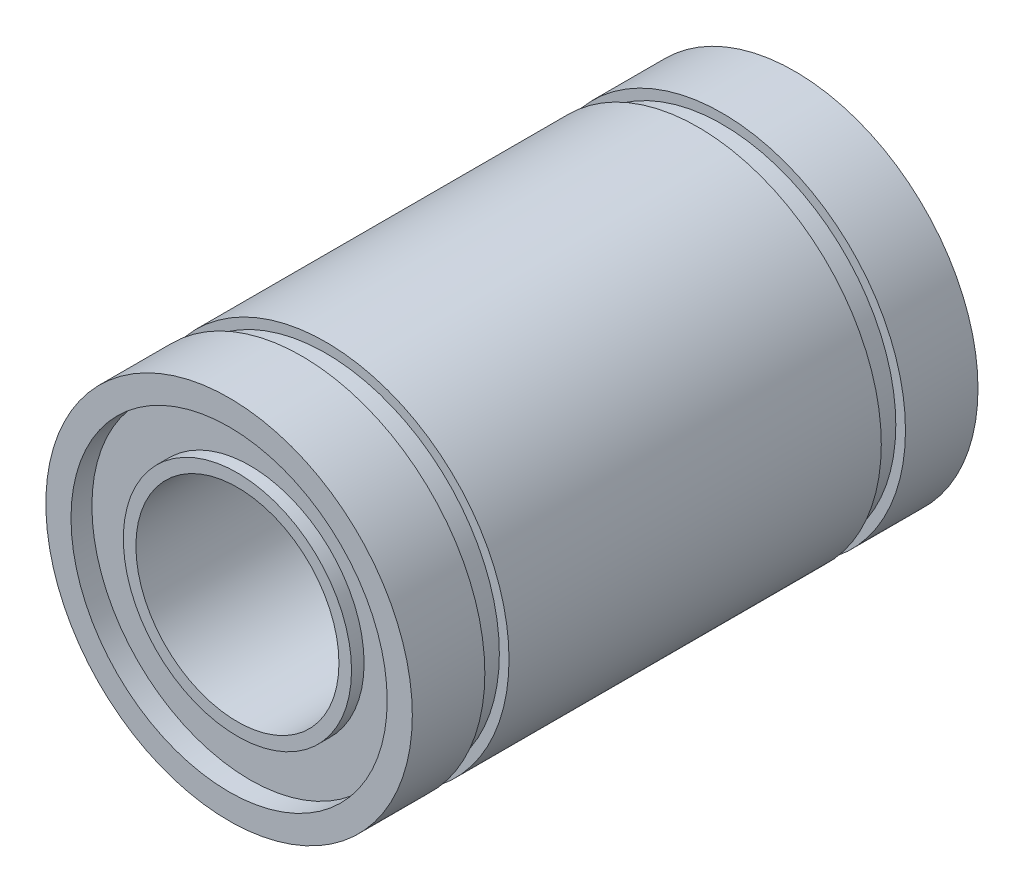
ISO-10303-21;
HEADER;
FILE_DESCRIPTION(('STEP AP214'),'2;1');
FILE_NAME('part.step','',(''),(''),'','','');
FILE_SCHEMA(('AUTOMOTIVE_DESIGN { 1 0 10303 214 1 1 1 1 }'));
ENDSEC;
DATA;
#1=APPLICATION_CONTEXT('core data for automotive mechanical design processes');
#2=APPLICATION_PROTOCOL_DEFINITION('international standard','automotive_design',2000,#1);
#3=PRODUCT_CONTEXT('',#1,'mechanical');
#4=PRODUCT('Part','Part','',(#3));
#5=PRODUCT_RELATED_PRODUCT_CATEGORY('part','',(#4));
#6=PRODUCT_DEFINITION_FORMATION('','',#4);
#7=PRODUCT_DEFINITION_CONTEXT('part definition',#1,'design');
#8=PRODUCT_DEFINITION('design','',#6,#7);
#9=PRODUCT_DEFINITION_SHAPE('','',#8);
#10=(LENGTH_UNIT() NAMED_UNIT(*) SI_UNIT(.MILLI.,.METRE.));
#11=(NAMED_UNIT(*) PLANE_ANGLE_UNIT() SI_UNIT($,.RADIAN.));
#12=(NAMED_UNIT(*) SI_UNIT($,.STERADIAN.) SOLID_ANGLE_UNIT());
#13=UNCERTAINTY_MEASURE_WITH_UNIT(LENGTH_MEASURE(1.E-05),#10,'distance_accuracy_value','');
#14=(GEOMETRIC_REPRESENTATION_CONTEXT(3) GLOBAL_UNCERTAINTY_ASSIGNED_CONTEXT((#13)) GLOBAL_UNIT_ASSIGNED_CONTEXT((#10,
#11,#12)) REPRESENTATION_CONTEXT('',''));
#15=CARTESIAN_POINT('',(0.,0.,0.));
#16=DIRECTION('',(0.,0.,1.));
#17=DIRECTION('',(1.,0.,0.));
#18=AXIS2_PLACEMENT_3D('',#15,#16,#17);
#19=CARTESIAN_POINT('',(8.175,0.,28.169061095084));
#20=DIRECTION('',(0.,0.,-1.));
#21=DIRECTION('',(1.,0.,0.));
#22=AXIS2_PLACEMENT_3D('',#19,#20,#21);
#23=PLANE('',#22);
#24=CARTESIAN_POINT('',(0.,0.,28.169061095084));
#25=DIRECTION('',(0.,0.,1.));
#26=DIRECTION('',(1.,0.,0.));
#27=AXIS2_PLACEMENT_3D('',#24,#25,#26);
#28=CIRCLE('',#27,8.175);
#29=CARTESIAN_POINT('',(8.175,0.,28.169061095084));
#30=VERTEX_POINT('',#29);
#31=EDGE_CURVE('E54',#30,#30,#28,.T.);
#32=ORIENTED_EDGE('',*,*,#31,.T.);
#33=EDGE_LOOP('',(#32));
#34=FACE_BOUND('',#33,.T.);
#35=CARTESIAN_POINT('',(0.,0.,28.169061095084));
#36=DIRECTION('',(0.,0.,-1.));
#37=DIRECTION('',(-1.,0.,0.));
#38=AXIS2_PLACEMENT_3D('',#35,#36,#37);
#39=CIRCLE('',#38,5.89999999999996);
#40=CARTESIAN_POINT('',(-5.89999999999996,0.,28.169061095084));
#41=VERTEX_POINT('',#40);
#42=EDGE_CURVE('E10',#41,#41,#39,.F.);
#43=ORIENTED_EDGE('',*,*,#42,.F.);
#44=EDGE_LOOP('',(#43));
#45=FACE_BOUND('',#44,.T.);
#46=ADVANCED_FACE('F32',(#34,#45),#23,.F.);
#47=CARTESIAN_POINT('',(8.175,0.,1.1));
#48=DIRECTION('',(0.,0.,1.));
#49=DIRECTION('',(1.,0.,0.));
#50=AXIS2_PLACEMENT_3D('',#47,#48,#49);
#51=PLANE('',#50);
#52=CARTESIAN_POINT('',(0.,0.,1.1));
#53=DIRECTION('',(0.,0.,1.));
#54=DIRECTION('',(1.,0.,0.));
#55=AXIS2_PLACEMENT_3D('',#52,#53,#54);
#56=CIRCLE('',#55,8.175);
#57=CARTESIAN_POINT('',(8.175,0.,1.1));
#58=VERTEX_POINT('',#57);
#59=EDGE_CURVE('E71',#58,#58,#56,.T.);
#60=ORIENTED_EDGE('',*,*,#59,.F.);
#61=EDGE_LOOP('',(#60));
#62=FACE_BOUND('',#61,.T.);
#63=CARTESIAN_POINT('',(0.,0.,1.1));
#64=DIRECTION('',(0.,0.,1.));
#65=DIRECTION('',(1.,0.,0.));
#66=AXIS2_PLACEMENT_3D('',#63,#64,#65);
#67=CIRCLE('',#66,5.89999999999996);
#68=CARTESIAN_POINT('',(5.89999999999996,0.,1.1));
#69=VERTEX_POINT('',#68);
#70=EDGE_CURVE('E39',#69,#69,#67,.F.);
#71=ORIENTED_EDGE('',*,*,#70,.F.);
#72=EDGE_LOOP('',(#71));
#73=FACE_BOUND('',#72,.T.);
#74=ADVANCED_FACE('F114',(#62,#73),#51,.F.);
#75=CARTESIAN_POINT('',(0.,0.,29.25));
#76=DIRECTION('',(0.,0.,-1.));
#77=DIRECTION('',(-1.,0.,0.));
#78=AXIS2_PLACEMENT_3D('',#75,#76,#77);
#79=CYLINDRICAL_SURFACE('',#78,9.475);
#80=CARTESIAN_POINT('',(0.,0.,3.75));
#81=DIRECTION('',(0.,0.,1.));
#82=DIRECTION('',(1.,0.,0.));
#83=AXIS2_PLACEMENT_3D('',#80,#81,#82);
#84=CIRCLE('',#83,9.475);
#85=CARTESIAN_POINT('',(9.475,0.,3.75));
#86=VERTEX_POINT('',#85);
#87=EDGE_CURVE('E61',#86,#86,#84,.T.);
#88=ORIENTED_EDGE('',*,*,#87,.F.);
#89=EDGE_LOOP('',(#88));
#90=FACE_BOUND('',#89,.T.);
#91=CARTESIAN_POINT('',(0.,0.,0.));
#92=DIRECTION('',(0.,0.,1.));
#93=DIRECTION('',(1.,0.,0.));
#94=AXIS2_PLACEMENT_3D('',#91,#92,#93);
#95=CIRCLE('',#94,9.475);
#96=CARTESIAN_POINT('',(9.475,0.,0.));
#97=VERTEX_POINT('',#96);
#98=EDGE_CURVE('E47',#97,#97,#95,.T.);
#99=ORIENTED_EDGE('',*,*,#98,.T.);
#100=EDGE_LOOP('',(#99));
#101=FACE_BOUND('',#100,.T.);
#102=ADVANCED_FACE('F34',(#90,#101),#79,.T.);
#103=CARTESIAN_POINT('',(0.,0.,0.));
#104=DIRECTION('',(0.,0.,1.));
#105=DIRECTION('',(1.,0.,0.));
#106=AXIS2_PLACEMENT_3D('',#103,#104,#105);
#107=PLANE('',#106);
#108=CARTESIAN_POINT('',(0.,0.,0.));
#109=DIRECTION('',(0.,0.,1.));
#110=DIRECTION('',(1.,0.,0.));
#111=AXIS2_PLACEMENT_3D('',#108,#109,#110);
#112=CIRCLE('',#111,8.175);
#113=CARTESIAN_POINT('',(8.175,0.,0.));
#114=VERTEX_POINT('',#113);
#115=EDGE_CURVE('E53',#114,#114,#112,.T.);
#116=ORIENTED_EDGE('',*,*,#115,.T.);
#117=EDGE_LOOP('',(#116));
#118=FACE_BOUND('',#117,.T.);
#119=ORIENTED_EDGE('',*,*,#98,.F.);
#120=EDGE_LOOP('',(#119));
#121=FACE_BOUND('',#120,.T.);
#122=ADVANCED_FACE('F144',(#118,#121),#107,.F.);
#123=CARTESIAN_POINT('',(9.475,0.,5.));
#124=DIRECTION('',(0.,0.,1.));
#125=DIRECTION('',(1.,0.,0.));
#126=AXIS2_PLACEMENT_3D('',#123,#124,#125);
#127=PLANE('',#126);
#128=CARTESIAN_POINT('',(0.,0.,5.));
#129=DIRECTION('',(0.,0.,1.));
#130=DIRECTION('',(1.,0.,0.));
#131=AXIS2_PLACEMENT_3D('',#128,#129,#130);
#132=CIRCLE('',#131,9.475);
#133=CARTESIAN_POINT('',(9.475,0.,5.));
#134=VERTEX_POINT('',#133);
#135=EDGE_CURVE('E56',#134,#134,#132,.T.);
#136=ORIENTED_EDGE('',*,*,#135,.F.);
#137=EDGE_LOOP('',(#136));
#138=FACE_BOUND('',#137,.T.);
#139=CARTESIAN_POINT('',(0.,0.,5.));
#140=DIRECTION('',(0.,0.,1.));
#141=DIRECTION('',(1.,0.,0.));
#142=AXIS2_PLACEMENT_3D('',#139,#140,#141);
#143=CIRCLE('',#142,8.975);
#144=CARTESIAN_POINT('',(8.975,0.,5.));
#145=VERTEX_POINT('',#144);
#146=EDGE_CURVE('E74',#145,#145,#143,.T.);
#147=ORIENTED_EDGE('',*,*,#146,.T.);
#148=EDGE_LOOP('',(#147));
#149=FACE_BOUND('',#148,.T.);
#150=ADVANCED_FACE('F140',(#138,#149),#127,.F.);
#151=CARTESIAN_POINT('',(0.,0.,29.25));
#152=DIRECTION('',(0.,0.,1.));
#153=DIRECTION('',(1.,0.,0.));
#154=AXIS2_PLACEMENT_3D('',#151,#152,#153);
#155=CYLINDRICAL_SURFACE('',#154,8.975);
#156=ORIENTED_EDGE('',*,*,#146,.F.);
#157=EDGE_LOOP('',(#156));
#158=FACE_BOUND('',#157,.T.);
#159=CARTESIAN_POINT('',(0.,0.,3.75));
#160=DIRECTION('',(0.,0.,1.));
#161=DIRECTION('',(1.,0.,0.));
#162=AXIS2_PLACEMENT_3D('',#159,#160,#161);
#163=CIRCLE('',#162,8.975);
#164=CARTESIAN_POINT('',(8.975,0.,3.75));
#165=VERTEX_POINT('',#164);
#166=EDGE_CURVE('E77',#165,#165,#163,.T.);
#167=ORIENTED_EDGE('',*,*,#166,.T.);
#168=EDGE_LOOP('',(#167));
#169=FACE_BOUND('',#168,.T.);
#170=ADVANCED_FACE('F136',(#158,#169),#155,.T.);
#171=CARTESIAN_POINT('',(9.475,0.,3.75));
#172=DIRECTION('',(0.,0.,-1.));
#173=DIRECTION('',(-1.,0.,0.));
#174=AXIS2_PLACEMENT_3D('',#171,#172,#173);
#175=PLANE('',#174);
#176=ORIENTED_EDGE('',*,*,#166,.F.);
#177=EDGE_LOOP('',(#176));
#178=FACE_BOUND('',#177,.T.);
#179=ORIENTED_EDGE('',*,*,#87,.T.);
#180=EDGE_LOOP('',(#179));
#181=FACE_BOUND('',#180,.T.);
#182=ADVANCED_FACE('F132',(#178,#181),#175,.F.);
#183=ORIENTED_EDGE('',*,*,#135,.T.);
#184=EDGE_LOOP('',(#183));
#185=FACE_BOUND('',#184,.T.);
#186=CARTESIAN_POINT('',(0.,0.,24.25));
#187=DIRECTION('',(0.,0.,1.));
#188=DIRECTION('',(1.,0.,0.));
#189=AXIS2_PLACEMENT_3D('',#186,#187,#188);
#190=CIRCLE('',#189,9.475);
#191=CARTESIAN_POINT('',(9.475,0.,24.25));
#192=VERTEX_POINT('',#191);
#193=EDGE_CURVE('E68',#192,#192,#190,.T.);
#194=ORIENTED_EDGE('',*,*,#193,.F.);
#195=EDGE_LOOP('',(#194));
#196=FACE_BOUND('',#195,.T.);
#197=ADVANCED_FACE('F135',(#185,#196),#79,.T.);
#198=CARTESIAN_POINT('',(9.475,0.,25.5));
#199=DIRECTION('',(0.,0.,1.));
#200=DIRECTION('',(1.,0.,0.));
#201=AXIS2_PLACEMENT_3D('',#198,#199,#200);
#202=PLANE('',#201);
#203=CARTESIAN_POINT('',(0.,0.,25.5));
#204=DIRECTION('',(0.,0.,1.));
#205=DIRECTION('',(1.,0.,0.));
#206=AXIS2_PLACEMENT_3D('',#203,#204,#205);
#207=CIRCLE('',#206,9.475);
#208=CARTESIAN_POINT('',(9.475,0.,25.5));
#209=VERTEX_POINT('',#208);
#210=EDGE_CURVE('E58',#209,#209,#207,.T.);
#211=ORIENTED_EDGE('',*,*,#210,.F.);
#212=EDGE_LOOP('',(#211));
#213=FACE_BOUND('',#212,.T.);
#214=CARTESIAN_POINT('',(0.,0.,25.5));
#215=DIRECTION('',(0.,0.,1.));
#216=DIRECTION('',(1.,0.,0.));
#217=AXIS2_PLACEMENT_3D('',#214,#215,#216);
#218=CIRCLE('',#217,8.975);
#219=CARTESIAN_POINT('',(8.975,0.,25.5));
#220=VERTEX_POINT('',#219);
#221=EDGE_CURVE('E62',#220,#220,#218,.T.);
#222=ORIENTED_EDGE('',*,*,#221,.T.);
#223=EDGE_LOOP('',(#222));
#224=FACE_BOUND('',#223,.T.);
#225=ADVANCED_FACE('F154',(#213,#224),#202,.F.);
#226=CARTESIAN_POINT('',(0.,0.,29.25));
#227=DIRECTION('',(0.,0.,1.));
#228=DIRECTION('',(1.,0.,0.));
#229=AXIS2_PLACEMENT_3D('',#226,#227,#228);
#230=CYLINDRICAL_SURFACE('',#229,8.975);
#231=ORIENTED_EDGE('',*,*,#221,.F.);
#232=EDGE_LOOP('',(#231));
#233=FACE_BOUND('',#232,.T.);
#234=CARTESIAN_POINT('',(0.,0.,24.25));
#235=DIRECTION('',(0.,0.,1.));
#236=DIRECTION('',(1.,0.,0.));
#237=AXIS2_PLACEMENT_3D('',#234,#235,#236);
#238=CIRCLE('',#237,8.975);
#239=CARTESIAN_POINT('',(8.975,0.,24.25));
#240=VERTEX_POINT('',#239);
#241=EDGE_CURVE('E65',#240,#240,#238,.T.);
#242=ORIENTED_EDGE('',*,*,#241,.T.);
#243=EDGE_LOOP('',(#242));
#244=FACE_BOUND('',#243,.T.);
#245=ADVANCED_FACE('F150',(#233,#244),#230,.T.);
#246=CARTESIAN_POINT('',(9.475,0.,24.25));
#247=DIRECTION('',(0.,0.,-1.));
#248=DIRECTION('',(-1.,0.,0.));
#249=AXIS2_PLACEMENT_3D('',#246,#247,#248);
#250=PLANE('',#249);
#251=ORIENTED_EDGE('',*,*,#241,.F.);
#252=EDGE_LOOP('',(#251));
#253=FACE_BOUND('',#252,.T.);
#254=ORIENTED_EDGE('',*,*,#193,.T.);
#255=EDGE_LOOP('',(#254));
#256=FACE_BOUND('',#255,.T.);
#257=ADVANCED_FACE('F146',(#253,#256),#250,.F.);
#258=CARTESIAN_POINT('',(0.,0.,29.25));
#259=DIRECTION('',(0.,0.,1.));
#260=DIRECTION('',(1.,0.,0.));
#261=AXIS2_PLACEMENT_3D('',#258,#259,#260);
#262=PLANE('',#261);
#263=CARTESIAN_POINT('',(0.,0.,29.25));
#264=DIRECTION('',(0.,0.,1.));
#265=DIRECTION('',(1.,0.,0.));
#266=AXIS2_PLACEMENT_3D('',#263,#264,#265);
#267=CIRCLE('',#266,8.175);
#268=CARTESIAN_POINT('',(8.175,0.,29.25));
#269=VERTEX_POINT('',#268);
#270=EDGE_CURVE('E50',#269,#269,#267,.T.);
#271=ORIENTED_EDGE('',*,*,#270,.F.);
#272=EDGE_LOOP('',(#271));
#273=FACE_BOUND('',#272,.T.);
#274=CARTESIAN_POINT('',(0.,0.,29.25));
#275=DIRECTION('',(0.,0.,1.));
#276=DIRECTION('',(1.,0.,0.));
#277=AXIS2_PLACEMENT_3D('',#274,#275,#276);
#278=CIRCLE('',#277,9.475);
#279=CARTESIAN_POINT('',(9.475,0.,29.25));
#280=VERTEX_POINT('',#279);
#281=EDGE_CURVE('E43',#280,#280,#278,.T.);
#282=ORIENTED_EDGE('',*,*,#281,.T.);
#283=EDGE_LOOP('',(#282));
#284=FACE_BOUND('',#283,.T.);
#285=ADVANCED_FACE('F149',(#273,#284),#262,.T.);
#286=ORIENTED_EDGE('',*,*,#210,.T.);
#287=EDGE_LOOP('',(#286));
#288=FACE_BOUND('',#287,.T.);
#289=ORIENTED_EDGE('',*,*,#281,.F.);
#290=EDGE_LOOP('',(#289));
#291=FACE_BOUND('',#290,.T.);
#292=ADVANCED_FACE('F129',(#288,#291),#79,.T.);
#293=CARTESIAN_POINT('',(0.,0.,29.25));
#294=DIRECTION('',(0.,0.,1.));
#295=DIRECTION('',(1.,0.,0.));
#296=AXIS2_PLACEMENT_3D('',#293,#294,#295);
#297=CYLINDRICAL_SURFACE('',#296,8.175);
#298=ORIENTED_EDGE('',*,*,#115,.F.);
#299=EDGE_LOOP('',(#298));
#300=FACE_BOUND('',#299,.T.);
#301=ORIENTED_EDGE('',*,*,#59,.T.);
#302=EDGE_LOOP('',(#301));
#303=FACE_BOUND('',#302,.T.);
#304=ADVANCED_FACE('F127',(#300,#303),#297,.F.);
#305=CARTESIAN_POINT('',(0.,0.,0.0190610950839831));
#306=DIRECTION('',(0.,0.,-1.));
#307=DIRECTION('',(1.,0.,0.));
#308=AXIS2_PLACEMENT_3D('',#305,#306,#307);
#309=CYLINDRICAL_SURFACE('',#308,8.175);
#310=ORIENTED_EDGE('',*,*,#270,.T.);
#311=EDGE_LOOP('',(#310));
#312=FACE_BOUND('',#311,.T.);
#313=ORIENTED_EDGE('',*,*,#31,.F.);
#314=EDGE_LOOP('',(#313));
#315=FACE_BOUND('',#314,.T.);
#316=ADVANCED_FACE('F125',(#312,#315),#309,.F.);
#317=CARTESIAN_POINT('',(0.,0.,1.1));
#318=DIRECTION('',(0.,0.,-1.));
#319=DIRECTION('',(-1.,0.,0.));
#320=AXIS2_PLACEMENT_3D('',#317,#318,#319);
#321=CYLINDRICAL_SURFACE('',#320,5.24999999999999);
#322=CARTESIAN_POINT('',(0.,0.,0.449999999999999));
#323=DIRECTION('',(0.,0.,1.));
#324=DIRECTION('',(1.,0.,0.));
#325=AXIS2_PLACEMENT_3D('',#322,#323,#324);
#326=CIRCLE('',#325,5.24999999999996);
#327=CARTESIAN_POINT('',(5.24999999999996,0.,0.449999999999999));
#328=VERTEX_POINT('',#327);
#329=EDGE_CURVE('E91',#328,#328,#326,.T.);
#330=ORIENTED_EDGE('',*,*,#329,.F.);
#331=EDGE_LOOP('',(#330));
#332=FACE_BOUND('',#331,.T.);
#333=CARTESIAN_POINT('',(0.,0.,28.819061095084));
#334=DIRECTION('',(0.,0.,1.));
#335=DIRECTION('',(1.,0.,0.));
#336=AXIS2_PLACEMENT_3D('',#333,#334,#335);
#337=CIRCLE('',#336,5.24999999999996);
#338=CARTESIAN_POINT('',(5.24999999999996,0.,28.819061095084));
#339=VERTEX_POINT('',#338);
#340=EDGE_CURVE('E97',#339,#339,#337,.T.);
#341=ORIENTED_EDGE('',*,*,#340,.T.);
#342=EDGE_LOOP('',(#341));
#343=FACE_BOUND('',#342,.T.);
#344=ADVANCED_FACE('F101',(#332,#343),#321,.F.);
#345=CARTESIAN_POINT('',(0.,0.,29.269061095084));
#346=DIRECTION('',(0.,0.,1.));
#347=DIRECTION('',(1.,0.,0.));
#348=AXIS2_PLACEMENT_3D('',#345,#346,#347);
#349=CYLINDRICAL_SURFACE('',#348,5.89999999999996);
#350=ORIENTED_EDGE('',*,*,#70,.T.);
#351=EDGE_LOOP('',(#350));
#352=FACE_BOUND('',#351,.T.);
#353=CARTESIAN_POINT('',(0.,0.,0.449999999999999));
#354=DIRECTION('',(0.,0.,1.));
#355=DIRECTION('',(1.,0.,0.));
#356=AXIS2_PLACEMENT_3D('',#353,#354,#355);
#357=CIRCLE('',#356,5.89999999999996);
#358=CARTESIAN_POINT('',(5.89999999999996,0.,0.449999999999999));
#359=VERTEX_POINT('',#358);
#360=EDGE_CURVE('E88',#359,#359,#357,.T.);
#361=ORIENTED_EDGE('',*,*,#360,.T.);
#362=EDGE_LOOP('',(#361));
#363=FACE_BOUND('',#362,.T.);
#364=ADVANCED_FACE('F213',(#352,#363),#349,.T.);
#365=CARTESIAN_POINT('',(0.,5.24999999999996,0.449999999999999));
#366=DIRECTION('',(0.,0.,1.));
#367=DIRECTION('',(1.,0.,0.));
#368=AXIS2_PLACEMENT_3D('',#365,#366,#367);
#369=PLANE('',#368);
#370=ORIENTED_EDGE('',*,*,#360,.F.);
#371=EDGE_LOOP('',(#370));
#372=FACE_BOUND('',#371,.T.);
#373=ORIENTED_EDGE('',*,*,#329,.T.);
#374=EDGE_LOOP('',(#373));
#375=FACE_BOUND('',#374,.T.);
#376=ADVANCED_FACE('F111',(#372,#375),#369,.F.);
#377=CARTESIAN_POINT('',(0.,0.,0.));
#378=DIRECTION('',(0.,0.,-1.));
#379=DIRECTION('',(1.,0.,0.));
#380=AXIS2_PLACEMENT_3D('',#377,#378,#379);
#381=CYLINDRICAL_SURFACE('',#380,5.89999999999996);
#382=ORIENTED_EDGE('',*,*,#42,.T.);
#383=EDGE_LOOP('',(#382));
#384=FACE_BOUND('',#383,.T.);
#385=CARTESIAN_POINT('',(0.,0.,28.819061095084));
#386=DIRECTION('',(0.,0.,1.));
#387=DIRECTION('',(1.,0.,0.));
#388=AXIS2_PLACEMENT_3D('',#385,#386,#387);
#389=CIRCLE('',#388,5.89999999999996);
#390=CARTESIAN_POINT('',(5.89999999999996,0.,28.819061095084));
#391=VERTEX_POINT('',#390);
#392=EDGE_CURVE('E94',#391,#391,#389,.T.);
#393=ORIENTED_EDGE('',*,*,#392,.F.);
#394=EDGE_LOOP('',(#393));
#395=FACE_BOUND('',#394,.T.);
#396=ADVANCED_FACE('F105',(#384,#395),#381,.T.);
#397=CARTESIAN_POINT('',(0.,5.24999999999996,28.819061095084));
#398=DIRECTION('',(0.,0.,-1.));
#399=DIRECTION('',(1.,0.,0.));
#400=AXIS2_PLACEMENT_3D('',#397,#398,#399);
#401=PLANE('',#400);
#402=ORIENTED_EDGE('',*,*,#392,.T.);
#403=EDGE_LOOP('',(#402));
#404=FACE_BOUND('',#403,.T.);
#405=ORIENTED_EDGE('',*,*,#340,.F.);
#406=EDGE_LOOP('',(#405));
#407=FACE_BOUND('',#406,.T.);
#408=ADVANCED_FACE('F103',(#404,#407),#401,.F.);
#409=CLOSED_SHELL('',(#46,#74,#102,#122,#150,#170,#182,#197,#225,#245,#257,#285,#292,#304,#316,
#344,#364,#376,#396,#408));
#410=MANIFOLD_SOLID_BREP('B2',#409);
#411=ADVANCED_BREP_SHAPE_REPRESENTATION('',(#18,#410),#14);
#412=SHAPE_DEFINITION_REPRESENTATION(#9,#411);
ENDSEC;
END-ISO-10303-21;
